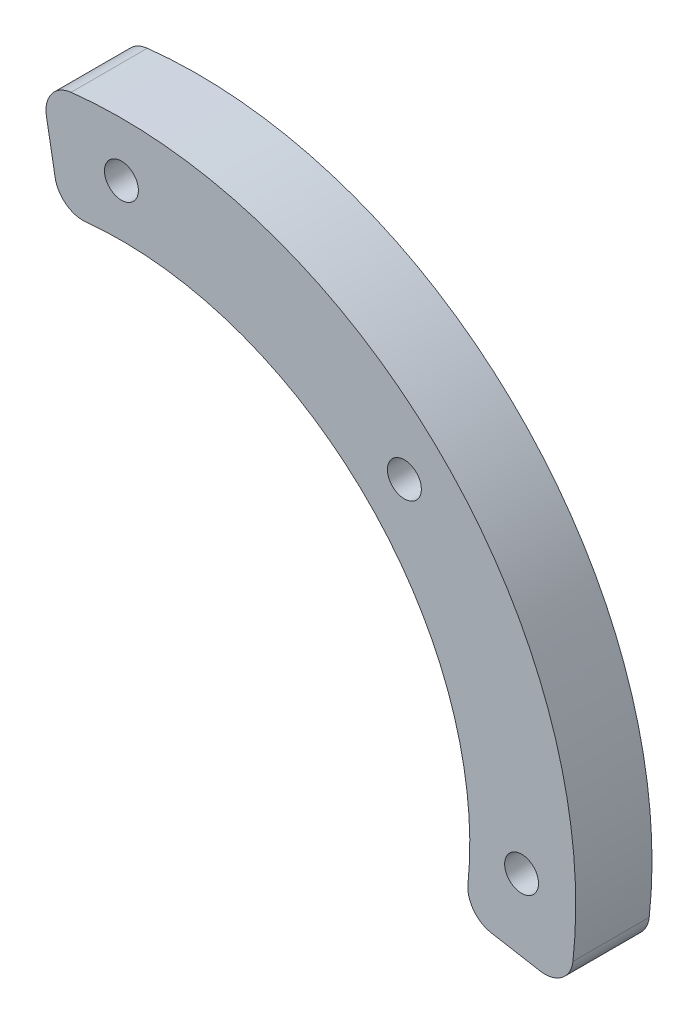
ISO-10303-21;
HEADER;
FILE_DESCRIPTION(('STEP AP214'),'2;1');
FILE_NAME('part.step','',(''),(''),'','','');
FILE_SCHEMA(('AUTOMOTIVE_DESIGN { 1 0 10303 214 1 1 1 1 }'));
ENDSEC;
DATA;
#1=APPLICATION_CONTEXT('core data for automotive mechanical design processes');
#2=APPLICATION_PROTOCOL_DEFINITION('international standard','automotive_design',2000,#1);
#3=PRODUCT_CONTEXT('',#1,'mechanical');
#4=PRODUCT('Part','Part','',(#3));
#5=PRODUCT_RELATED_PRODUCT_CATEGORY('part','',(#4));
#6=PRODUCT_DEFINITION_FORMATION('','',#4);
#7=PRODUCT_DEFINITION_CONTEXT('part definition',#1,'design');
#8=PRODUCT_DEFINITION('design','',#6,#7);
#9=PRODUCT_DEFINITION_SHAPE('','',#8);
#10=(LENGTH_UNIT() NAMED_UNIT(*) SI_UNIT(.MILLI.,.METRE.));
#11=(NAMED_UNIT(*) PLANE_ANGLE_UNIT() SI_UNIT($,.RADIAN.));
#12=(NAMED_UNIT(*) SI_UNIT($,.STERADIAN.) SOLID_ANGLE_UNIT());
#13=UNCERTAINTY_MEASURE_WITH_UNIT(LENGTH_MEASURE(1.E-05),#10,'distance_accuracy_value','');
#14=(GEOMETRIC_REPRESENTATION_CONTEXT(3) GLOBAL_UNCERTAINTY_ASSIGNED_CONTEXT((#13)) GLOBAL_UNIT_ASSIGNED_CONTEXT((#10,
#11,#12)) REPRESENTATION_CONTEXT('',''));
#15=CARTESIAN_POINT('',(0.,0.,0.));
#16=DIRECTION('',(0.,0.,1.));
#17=DIRECTION('',(1.,0.,0.));
#18=AXIS2_PLACEMENT_3D('',#15,#16,#17);
#19=CARTESIAN_POINT('',(-25.1324037442674,24.9847235852437,8.1));
#20=DIRECTION('',(0.,0.,1.));
#21=DIRECTION('',(1.,0.,0.));
#22=AXIS2_PLACEMENT_3D('',#19,#20,#21);
#23=PLANE('',#22);
#24=CARTESIAN_POINT('',(9.93444194469549,10.0655020095336,8.1));
#25=DIRECTION('',(0.,0.,1.));
#26=DIRECTION('',(1.,0.,0.));
#27=AXIS2_PLACEMENT_3D('',#24,#25,#26);
#28=CIRCLE('',#27,1.8);
#29=CARTESIAN_POINT('',(11.7344419446955,10.0655020095336,8.1));
#30=VERTEX_POINT('',#29);
#31=EDGE_CURVE('E187',#30,#30,#28,.T.);
#32=ORIENTED_EDGE('',*,*,#31,.F.);
#33=EDGE_LOOP('',(#32));
#34=FACE_BOUND('',#33,.T.);
#35=CARTESIAN_POINT('',(-25.1324037442674,24.9847235852437,8.1));
#36=DIRECTION('',(0.,0.,1.));
#37=DIRECTION('',(1.,0.,0.));
#38=AXIS2_PLACEMENT_3D('',#35,#36,#37);
#39=CIRCLE('',#38,3.00000000000002);
#40=CARTESIAN_POINT('',(-25.4648771689216,27.9662435704021,8.1));
#41=VERTEX_POINT('',#40);
#42=CARTESIAN_POINT('',(-28.0853214849759,24.4553118205378,8.1));
#43=VERTEX_POINT('',#42);
#44=EDGE_CURVE('E150',#41,#43,#39,.T.);
#45=ORIENTED_EDGE('',*,*,#44,.T.);
#46=DIRECTION('',(0.176470588235296,-0.9843059135695,0.));
#47=VECTOR('',#46,1.);
#48=CARTESIAN_POINT('',(-28.0853214849759,24.4553118205378,8.1));
#49=LINE('',#48,#47);
#50=CARTESIAN_POINT('',(-27.1565388469723,19.2748097768281,8.1));
#51=VERTEX_POINT('',#50);
#52=EDGE_CURVE('E98',#43,#51,#49,.T.);
#53=ORIENTED_EDGE('',*,*,#52,.T.);
#54=CARTESIAN_POINT('',(-24.2036211062638,19.804221541534,8.1));
#55=DIRECTION('',(0.,0.,1.));
#56=DIRECTION('',(1.,0.,0.));
#57=AXIS2_PLACEMENT_3D('',#54,#55,#56);
#58=CIRCLE('',#57,3.);
#59=CARTESIAN_POINT('',(-23.897169242474,16.8199147116018,8.1));
#60=VERTEX_POINT('',#59);
#61=EDGE_CURVE('E165',#51,#60,#58,.T.);
#62=ORIENTED_EDGE('',*,*,#61,.T.);
#63=CARTESIAN_POINT('',(-20.1175962557326,-19.9865361908948,8.1));
#64=DIRECTION('',(0.,0.,-1.));
#65=DIRECTION('',(1.,0.,0.));
#66=AXIS2_PLACEMENT_3D('',#63,#64,#65);
#67=CIRCLE('',#66,37.);
#68=CARTESIAN_POINT('',(16.6882017617358,-23.7724617444842,8.1));
#69=VERTEX_POINT('',#68);
#70=EDGE_CURVE('E178',#60,#69,#67,.T.);
#71=ORIENTED_EDGE('',*,*,#70,.T.);
#72=CARTESIAN_POINT('',(19.672455655044,-24.0794286812617,8.1));
#73=DIRECTION('',(0.,0.,1.));
#74=DIRECTION('',(1.,0.,0.));
#75=AXIS2_PLACEMENT_3D('',#72,#73,#74);
#76=CIRCLE('',#75,3.);
#77=CARTESIAN_POINT('',(19.1534558927314,-27.0341941959379,8.1));
#78=VERTEX_POINT('',#77);
#79=EDGE_CURVE('E117',#69,#78,#76,.T.);
#80=ORIENTED_EDGE('',*,*,#79,.T.);
#81=DIRECTION('',(0.984921838225387,-0.17299992077086,0.));
#82=VECTOR('',#81,1.);
#83=CARTESIAN_POINT('',(19.1534558927314,-27.0341941959379,8.1));
#84=LINE('',#83,#82);
#85=CARTESIAN_POINT('',(24.3359576647279,-27.9444922126472,8.1));
#86=VERTEX_POINT('',#85);
#87=EDGE_CURVE('E111',#78,#86,#84,.T.);
#88=ORIENTED_EDGE('',*,*,#87,.T.);
#89=CARTESIAN_POINT('',(24.8549574270404,-24.989726697971,8.1));
#90=DIRECTION('',(0.,0.,1.));
#91=DIRECTION('',(1.,0.,0.));
#92=AXIS2_PLACEMENT_3D('',#89,#90,#91);
#93=CIRCLE('',#92,3.00000000000001);
#94=CARTESIAN_POINT('',(27.8365631960641,-25.3214299360092,8.1));
#95=VERTEX_POINT('',#94);
#96=EDGE_CURVE('E115',#86,#95,#93,.T.);
#97=ORIENTED_EDGE('',*,*,#96,.T.);
#98=CARTESIAN_POINT('',(-20.1175962557326,-19.9865361908948,8.1));
#99=DIRECTION('',(0.,0.,1.));
#100=DIRECTION('',(1.,0.,0.));
#101=AXIS2_PLACEMENT_3D('',#98,#99,#100);
#102=CIRCLE('',#101,48.25);
#103=EDGE_CURVE('E55',#95,#41,#102,.T.);
#104=ORIENTED_EDGE('',*,*,#103,.T.);
#105=EDGE_LOOP('',(#45,#53,#62,#71,#80,#88,#97,#104));
#106=FACE_BOUND('',#105,.T.);
#107=CARTESIAN_POINT('',(22.3824037442674,-19.9865361908947,8.1));
#108=DIRECTION('',(0.,0.,1.));
#109=DIRECTION('',(1.,0.,0.));
#110=AXIS2_PLACEMENT_3D('',#107,#108,#109);
#111=CIRCLE('',#110,1.8);
#112=CARTESIAN_POINT('',(24.1824037442674,-19.9865361908947,8.1));
#113=VERTEX_POINT('',#112);
#114=EDGE_CURVE('E139',#113,#113,#111,.T.);
#115=ORIENTED_EDGE('',*,*,#114,.F.);
#116=EDGE_LOOP('',(#115));
#117=FACE_BOUND('',#116,.T.);
#118=CARTESIAN_POINT('',(-20.1175962557326,22.5134638091052,8.1));
#119=DIRECTION('',(0.,0.,1.));
#120=DIRECTION('',(1.,0.,0.));
#121=AXIS2_PLACEMENT_3D('',#118,#119,#120);
#122=CIRCLE('',#121,1.8);
#123=CARTESIAN_POINT('',(-18.3175962557326,22.5134638091052,8.1));
#124=VERTEX_POINT('',#123);
#125=EDGE_CURVE('E193',#124,#124,#122,.T.);
#126=ORIENTED_EDGE('',*,*,#125,.F.);
#127=EDGE_LOOP('',(#126));
#128=FACE_BOUND('',#127,.T.);
#129=ADVANCED_FACE('F38',(#34,#106,#117,#128),#23,.T.);
#130=CARTESIAN_POINT('',(-25.1324037442674,24.9847235852437,0.));
#131=DIRECTION('',(0.,0.,1.));
#132=DIRECTION('',(1.,0.,0.));
#133=AXIS2_PLACEMENT_3D('',#130,#131,#132);
#134=PLANE('',#133);
#135=CARTESIAN_POINT('',(-25.1324037442674,24.9847235852437,0.));
#136=DIRECTION('',(0.,0.,1.));
#137=DIRECTION('',(1.,0.,0.));
#138=AXIS2_PLACEMENT_3D('',#135,#136,#137);
#139=CIRCLE('',#138,3.00000000000002);
#140=CARTESIAN_POINT('',(-25.4648771689216,27.9662435704021,0.));
#141=VERTEX_POINT('',#140);
#142=CARTESIAN_POINT('',(-28.0853214849759,24.4553118205378,0.));
#143=VERTEX_POINT('',#142);
#144=EDGE_CURVE('E135',#141,#143,#139,.T.);
#145=ORIENTED_EDGE('',*,*,#144,.F.);
#146=CARTESIAN_POINT('',(-20.1175962557326,-19.9865361908948,0.));
#147=DIRECTION('',(0.,0.,1.));
#148=DIRECTION('',(1.,0.,0.));
#149=AXIS2_PLACEMENT_3D('',#146,#147,#148);
#150=CIRCLE('',#149,48.25);
#151=CARTESIAN_POINT('',(27.8365631960641,-25.3214299360092,0.));
#152=VERTEX_POINT('',#151);
#153=EDGE_CURVE('E90',#152,#141,#150,.T.);
#154=ORIENTED_EDGE('',*,*,#153,.F.);
#155=CARTESIAN_POINT('',(24.8549574270404,-24.989726697971,0.));
#156=DIRECTION('',(0.,0.,1.));
#157=DIRECTION('',(1.,0.,0.));
#158=AXIS2_PLACEMENT_3D('',#155,#156,#157);
#159=CIRCLE('',#158,3.00000000000001);
#160=CARTESIAN_POINT('',(24.3359576647279,-27.9444922126472,0.));
#161=VERTEX_POINT('',#160);
#162=EDGE_CURVE('E84',#161,#152,#159,.T.);
#163=ORIENTED_EDGE('',*,*,#162,.F.);
#164=DIRECTION('',(0.984921838225387,-0.17299992077086,0.));
#165=VECTOR('',#164,1.);
#166=CARTESIAN_POINT('',(19.1534558927314,-27.0341941959379,0.));
#167=LINE('',#166,#165);
#168=CARTESIAN_POINT('',(19.1534558927314,-27.0341941959379,0.));
#169=VERTEX_POINT('',#168);
#170=EDGE_CURVE('E125',#169,#161,#167,.T.);
#171=ORIENTED_EDGE('',*,*,#170,.F.);
#172=CARTESIAN_POINT('',(19.672455655044,-24.0794286812617,0.));
#173=DIRECTION('',(0.,0.,1.));
#174=DIRECTION('',(1.,0.,0.));
#175=AXIS2_PLACEMENT_3D('',#172,#173,#174);
#176=CIRCLE('',#175,3.);
#177=CARTESIAN_POINT('',(16.6882017617358,-23.7724617444842,0.));
#178=VERTEX_POINT('',#177);
#179=EDGE_CURVE('E145',#178,#169,#176,.T.);
#180=ORIENTED_EDGE('',*,*,#179,.F.);
#181=CARTESIAN_POINT('',(-20.1175962557326,-19.9865361908948,0.));
#182=DIRECTION('',(0.,0.,-1.));
#183=DIRECTION('',(1.,0.,0.));
#184=AXIS2_PLACEMENT_3D('',#181,#182,#183);
#185=CIRCLE('',#184,37.);
#186=CARTESIAN_POINT('',(-23.897169242474,16.8199147116018,0.));
#187=VERTEX_POINT('',#186);
#188=EDGE_CURVE('E143',#187,#178,#185,.T.);
#189=ORIENTED_EDGE('',*,*,#188,.F.);
#190=CARTESIAN_POINT('',(-24.2036211062638,19.804221541534,0.));
#191=DIRECTION('',(0.,0.,1.));
#192=DIRECTION('',(1.,0.,0.));
#193=AXIS2_PLACEMENT_3D('',#190,#191,#192);
#194=CIRCLE('',#193,3.);
#195=CARTESIAN_POINT('',(-27.1565388469723,19.2748097768281,0.));
#196=VERTEX_POINT('',#195);
#197=EDGE_CURVE('E141',#196,#187,#194,.T.);
#198=ORIENTED_EDGE('',*,*,#197,.F.);
#199=DIRECTION('',(0.176470588235296,-0.9843059135695,0.));
#200=VECTOR('',#199,1.);
#201=CARTESIAN_POINT('',(-28.0853214849759,24.4553118205378,0.));
#202=LINE('',#201,#200);
#203=EDGE_CURVE('E138',#143,#196,#202,.T.);
#204=ORIENTED_EDGE('',*,*,#203,.F.);
#205=EDGE_LOOP('',(#145,#154,#163,#171,#180,#189,#198,#204));
#206=FACE_BOUND('',#205,.T.);
#207=CARTESIAN_POINT('',(22.3824037442674,-19.9865361908947,0.));
#208=DIRECTION('',(0.,0.,1.));
#209=DIRECTION('',(1.,0.,0.));
#210=AXIS2_PLACEMENT_3D('',#207,#208,#209);
#211=CIRCLE('',#210,1.8);
#212=CARTESIAN_POINT('',(24.1824037442674,-19.9865361908947,0.));
#213=VERTEX_POINT('',#212);
#214=EDGE_CURVE('E184',#213,#213,#211,.T.);
#215=ORIENTED_EDGE('',*,*,#214,.T.);
#216=EDGE_LOOP('',(#215));
#217=FACE_BOUND('',#216,.T.);
#218=CARTESIAN_POINT('',(9.93444194469549,10.0655020095336,0.));
#219=DIRECTION('',(0.,0.,1.));
#220=DIRECTION('',(1.,0.,0.));
#221=AXIS2_PLACEMENT_3D('',#218,#219,#220);
#222=CIRCLE('',#221,1.8);
#223=CARTESIAN_POINT('',(11.7344419446955,10.0655020095336,0.));
#224=VERTEX_POINT('',#223);
#225=EDGE_CURVE('E190',#224,#224,#222,.T.);
#226=ORIENTED_EDGE('',*,*,#225,.T.);
#227=EDGE_LOOP('',(#226));
#228=FACE_BOUND('',#227,.T.);
#229=CARTESIAN_POINT('',(-20.1175962557326,22.5134638091052,0.));
#230=DIRECTION('',(0.,0.,1.));
#231=DIRECTION('',(1.,0.,0.));
#232=AXIS2_PLACEMENT_3D('',#229,#230,#231);
#233=CIRCLE('',#232,1.8);
#234=CARTESIAN_POINT('',(-18.3175962557326,22.5134638091052,0.));
#235=VERTEX_POINT('',#234);
#236=EDGE_CURVE('E196',#235,#235,#233,.T.);
#237=ORIENTED_EDGE('',*,*,#236,.T.);
#238=EDGE_LOOP('',(#237));
#239=FACE_BOUND('',#238,.T.);
#240=ADVANCED_FACE('F169',(#206,#217,#228,#239),#134,.F.);
#241=CARTESIAN_POINT('',(-25.1324037442674,24.9847235852437,8.1));
#242=DIRECTION('',(0.,0.,-1.));
#243=DIRECTION('',(-1.,0.,0.));
#244=AXIS2_PLACEMENT_3D('',#241,#242,#243);
#245=CYLINDRICAL_SURFACE('',#244,3.00000000000002);
#246=ORIENTED_EDGE('',*,*,#144,.T.);
#247=DIRECTION('',(0.,0.,-1.));
#248=VECTOR('',#247,1.);
#249=CARTESIAN_POINT('',(-28.0853214849759,24.4553118205378,8.1));
#250=LINE('',#249,#248);
#251=EDGE_CURVE('E11',#43,#143,#250,.T.);
#252=ORIENTED_EDGE('',*,*,#251,.F.);
#253=ORIENTED_EDGE('',*,*,#44,.F.);
#254=DIRECTION('',(0.,0.,-1.));
#255=VECTOR('',#254,1.);
#256=CARTESIAN_POINT('',(-25.4648771689216,27.9662435704021,8.1));
#257=LINE('',#256,#255);
#258=EDGE_CURVE('E131',#41,#141,#257,.T.);
#259=ORIENTED_EDGE('',*,*,#258,.T.);
#260=EDGE_LOOP('',(#246,#252,#253,#259));
#261=FACE_BOUND('',#260,.T.);
#262=ADVANCED_FACE('F40',(#261),#245,.T.);
#263=CARTESIAN_POINT('',(-28.0853214849759,24.4553118205378,8.1));
#264=DIRECTION('',(0.9843059135695,0.176470588235296,0.));
#265=DIRECTION('',(-0.176470588235296,0.9843059135695,0.));
#266=AXIS2_PLACEMENT_3D('',#263,#264,#265);
#267=PLANE('',#266);
#268=ORIENTED_EDGE('',*,*,#203,.T.);
#269=DIRECTION('',(0.,0.,-1.));
#270=VECTOR('',#269,1.);
#271=CARTESIAN_POINT('',(-27.1565388469723,19.2748097768281,8.1));
#272=LINE('',#271,#270);
#273=EDGE_CURVE('E47',#51,#196,#272,.T.);
#274=ORIENTED_EDGE('',*,*,#273,.F.);
#275=ORIENTED_EDGE('',*,*,#52,.F.);
#276=ORIENTED_EDGE('',*,*,#251,.T.);
#277=EDGE_LOOP('',(#268,#274,#275,#276));
#278=FACE_BOUND('',#277,.T.);
#279=ADVANCED_FACE('F229',(#278),#267,.F.);
#280=CARTESIAN_POINT('',(-24.2036211062638,19.804221541534,8.1));
#281=DIRECTION('',(0.,0.,-1.));
#282=DIRECTION('',(-1.,0.,0.));
#283=AXIS2_PLACEMENT_3D('',#280,#281,#282);
#284=CYLINDRICAL_SURFACE('',#283,3.);
#285=ORIENTED_EDGE('',*,*,#197,.T.);
#286=DIRECTION('',(0.,0.,-1.));
#287=VECTOR('',#286,1.);
#288=CARTESIAN_POINT('',(-23.897169242474,16.8199147116018,8.1));
#289=LINE('',#288,#287);
#290=EDGE_CURVE('E157',#60,#187,#289,.T.);
#291=ORIENTED_EDGE('',*,*,#290,.F.);
#292=ORIENTED_EDGE('',*,*,#61,.F.);
#293=ORIENTED_EDGE('',*,*,#273,.T.);
#294=EDGE_LOOP('',(#285,#291,#292,#293));
#295=FACE_BOUND('',#294,.T.);
#296=ADVANCED_FACE('F163',(#295),#284,.T.);
#297=CARTESIAN_POINT('',(-20.1175962557326,-19.9865361908948,8.1));
#298=DIRECTION('',(0.,0.,-1.));
#299=DIRECTION('',(-1.,0.,0.));
#300=AXIS2_PLACEMENT_3D('',#297,#298,#299);
#301=CYLINDRICAL_SURFACE('',#300,37.);
#302=ORIENTED_EDGE('',*,*,#188,.T.);
#303=DIRECTION('',(0.,0.,-1.));
#304=VECTOR('',#303,1.);
#305=CARTESIAN_POINT('',(16.6882017617358,-23.7724617444842,8.1));
#306=LINE('',#305,#304);
#307=EDGE_CURVE('E154',#69,#178,#306,.T.);
#308=ORIENTED_EDGE('',*,*,#307,.F.);
#309=ORIENTED_EDGE('',*,*,#70,.F.);
#310=ORIENTED_EDGE('',*,*,#290,.T.);
#311=EDGE_LOOP('',(#302,#308,#309,#310));
#312=FACE_BOUND('',#311,.T.);
#313=ADVANCED_FACE('F174',(#312),#301,.F.);
#314=CARTESIAN_POINT('',(19.672455655044,-24.0794286812617,8.1));
#315=DIRECTION('',(0.,0.,-1.));
#316=DIRECTION('',(-1.,0.,0.));
#317=AXIS2_PLACEMENT_3D('',#314,#315,#316);
#318=CYLINDRICAL_SURFACE('',#317,3.);
#319=ORIENTED_EDGE('',*,*,#179,.T.);
#320=DIRECTION('',(0.,0.,-1.));
#321=VECTOR('',#320,1.);
#322=CARTESIAN_POINT('',(19.1534558927314,-27.0341941959379,8.1));
#323=LINE('',#322,#321);
#324=EDGE_CURVE('E126',#78,#169,#323,.T.);
#325=ORIENTED_EDGE('',*,*,#324,.F.);
#326=ORIENTED_EDGE('',*,*,#79,.F.);
#327=ORIENTED_EDGE('',*,*,#307,.T.);
#328=EDGE_LOOP('',(#319,#325,#326,#327));
#329=FACE_BOUND('',#328,.T.);
#330=ADVANCED_FACE('F177',(#329),#318,.T.);
#331=CARTESIAN_POINT('',(19.1534558927314,-27.0341941959379,8.1));
#332=DIRECTION('',(0.17299992077086,0.984921838225387,0.));
#333=DIRECTION('',(-0.984921838225388,0.17299992077086,0.));
#334=AXIS2_PLACEMENT_3D('',#331,#332,#333);
#335=PLANE('',#334);
#336=ORIENTED_EDGE('',*,*,#170,.T.);
#337=DIRECTION('',(0.,0.,-1.));
#338=VECTOR('',#337,1.);
#339=CARTESIAN_POINT('',(24.3359576647279,-27.9444922126472,8.1));
#340=LINE('',#339,#338);
#341=EDGE_CURVE('E122',#86,#161,#340,.T.);
#342=ORIENTED_EDGE('',*,*,#341,.F.);
#343=ORIENTED_EDGE('',*,*,#87,.F.);
#344=ORIENTED_EDGE('',*,*,#324,.T.);
#345=EDGE_LOOP('',(#336,#342,#343,#344));
#346=FACE_BOUND('',#345,.T.);
#347=ADVANCED_FACE('F123',(#346),#335,.F.);
#348=CARTESIAN_POINT('',(24.8549574270404,-24.989726697971,8.1));
#349=DIRECTION('',(0.,0.,-1.));
#350=DIRECTION('',(-1.,0.,0.));
#351=AXIS2_PLACEMENT_3D('',#348,#349,#350);
#352=CYLINDRICAL_SURFACE('',#351,3.00000000000001);
#353=ORIENTED_EDGE('',*,*,#162,.T.);
#354=DIRECTION('',(0.,0.,-1.));
#355=VECTOR('',#354,1.);
#356=CARTESIAN_POINT('',(27.8365631960641,-25.3214299360092,8.1));
#357=LINE('',#356,#355);
#358=EDGE_CURVE('E127',#95,#152,#357,.T.);
#359=ORIENTED_EDGE('',*,*,#358,.F.);
#360=ORIENTED_EDGE('',*,*,#96,.F.);
#361=ORIENTED_EDGE('',*,*,#341,.T.);
#362=EDGE_LOOP('',(#353,#359,#360,#361));
#363=FACE_BOUND('',#362,.T.);
#364=ADVANCED_FACE('F129',(#363),#352,.T.);
#365=CARTESIAN_POINT('',(-20.1175962557326,-19.9865361908948,8.1));
#366=DIRECTION('',(0.,0.,-1.));
#367=DIRECTION('',(-1.,0.,0.));
#368=AXIS2_PLACEMENT_3D('',#365,#366,#367);
#369=CYLINDRICAL_SURFACE('',#368,48.25);
#370=ORIENTED_EDGE('',*,*,#153,.T.);
#371=ORIENTED_EDGE('',*,*,#258,.F.);
#372=ORIENTED_EDGE('',*,*,#103,.F.);
#373=ORIENTED_EDGE('',*,*,#358,.T.);
#374=EDGE_LOOP('',(#370,#371,#372,#373));
#375=FACE_BOUND('',#374,.T.);
#376=ADVANCED_FACE('F217',(#375),#369,.T.);
#377=CARTESIAN_POINT('',(22.3824037442674,-19.9865361908947,8.1));
#378=DIRECTION('',(0.,0.,-1.));
#379=DIRECTION('',(-1.,0.,0.));
#380=AXIS2_PLACEMENT_3D('',#377,#378,#379);
#381=CYLINDRICAL_SURFACE('',#380,1.8);
#382=ORIENTED_EDGE('',*,*,#114,.T.);
#383=EDGE_LOOP('',(#382));
#384=FACE_BOUND('',#383,.T.);
#385=ORIENTED_EDGE('',*,*,#214,.F.);
#386=EDGE_LOOP('',(#385));
#387=FACE_BOUND('',#386,.T.);
#388=ADVANCED_FACE('F214',(#384,#387),#381,.F.);
#389=CARTESIAN_POINT('',(9.93444194469549,10.0655020095336,8.1));
#390=DIRECTION('',(0.,0.,-1.));
#391=DIRECTION('',(-1.,0.,0.));
#392=AXIS2_PLACEMENT_3D('',#389,#390,#391);
#393=CYLINDRICAL_SURFACE('',#392,1.8);
#394=ORIENTED_EDGE('',*,*,#31,.T.);
#395=EDGE_LOOP('',(#394));
#396=FACE_BOUND('',#395,.T.);
#397=ORIENTED_EDGE('',*,*,#225,.F.);
#398=EDGE_LOOP('',(#397));
#399=FACE_BOUND('',#398,.T.);
#400=ADVANCED_FACE('F305',(#396,#399),#393,.F.);
#401=CARTESIAN_POINT('',(-20.1175962557326,22.5134638091052,8.1));
#402=DIRECTION('',(0.,0.,-1.));
#403=DIRECTION('',(-1.,0.,0.));
#404=AXIS2_PLACEMENT_3D('',#401,#402,#403);
#405=CYLINDRICAL_SURFACE('',#404,1.8);
#406=ORIENTED_EDGE('',*,*,#125,.T.);
#407=EDGE_LOOP('',(#406));
#408=FACE_BOUND('',#407,.T.);
#409=ORIENTED_EDGE('',*,*,#236,.F.);
#410=EDGE_LOOP('',(#409));
#411=FACE_BOUND('',#410,.T.);
#412=ADVANCED_FACE('F202',(#408,#411),#405,.F.);
#413=CLOSED_SHELL('',(#129,#240,#262,#279,#296,#313,#330,#347,#364,#376,#388,#400,#412));
#414=MANIFOLD_SOLID_BREP('B2',#413);
#415=ADVANCED_BREP_SHAPE_REPRESENTATION('',(#18,#414),#14);
#416=SHAPE_DEFINITION_REPRESENTATION(#9,#415);
ENDSEC;
END-ISO-10303-21;
